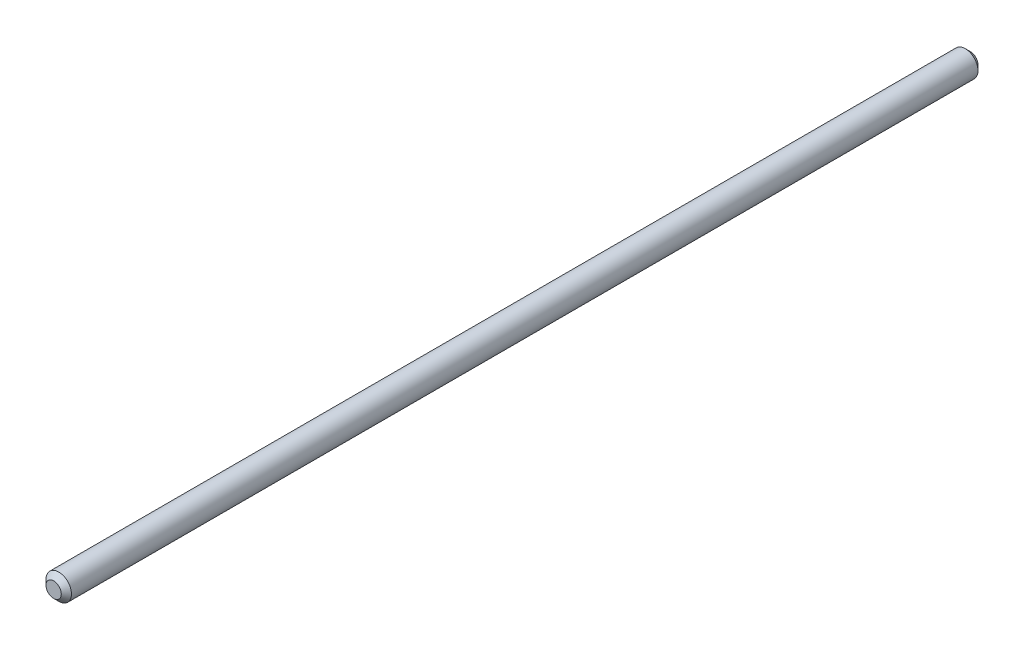
ISO-10303-21;
HEADER;
FILE_DESCRIPTION(('STEP AP214'),'2;1');
FILE_NAME('part.step','',(''),(''),'','','');
FILE_SCHEMA(('AUTOMOTIVE_DESIGN { 1 0 10303 214 1 1 1 1 }'));
ENDSEC;
DATA;
#1=APPLICATION_CONTEXT('core data for automotive mechanical design processes');
#2=APPLICATION_PROTOCOL_DEFINITION('international standard','automotive_design',2000,#1);
#3=PRODUCT_CONTEXT('',#1,'mechanical');
#4=PRODUCT('Part','Part','',(#3));
#5=PRODUCT_RELATED_PRODUCT_CATEGORY('part','',(#4));
#6=PRODUCT_DEFINITION_FORMATION('','',#4);
#7=PRODUCT_DEFINITION_CONTEXT('part definition',#1,'design');
#8=PRODUCT_DEFINITION('design','',#6,#7);
#9=PRODUCT_DEFINITION_SHAPE('','',#8);
#10=(LENGTH_UNIT() NAMED_UNIT(*) SI_UNIT(.MILLI.,.METRE.));
#11=(NAMED_UNIT(*) PLANE_ANGLE_UNIT() SI_UNIT($,.RADIAN.));
#12=(NAMED_UNIT(*) SI_UNIT($,.STERADIAN.) SOLID_ANGLE_UNIT());
#13=UNCERTAINTY_MEASURE_WITH_UNIT(LENGTH_MEASURE(1.E-05),#10,'distance_accuracy_value','');
#14=(GEOMETRIC_REPRESENTATION_CONTEXT(3) GLOBAL_UNCERTAINTY_ASSIGNED_CONTEXT((#13)) GLOBAL_UNIT_ASSIGNED_CONTEXT((#10,
#11,#12)) REPRESENTATION_CONTEXT('',''));
#15=CARTESIAN_POINT('',(0.,0.,0.));
#16=DIRECTION('',(0.,0.,1.));
#17=DIRECTION('',(1.,0.,0.));
#18=AXIS2_PLACEMENT_3D('',#15,#16,#17);
#19=CARTESIAN_POINT('',(0.,0.,90.));
#20=DIRECTION('',(0.,0.,-1.));
#21=DIRECTION('',(-1.,0.,0.));
#22=AXIS2_PLACEMENT_3D('',#19,#20,#21);
#23=CYLINDRICAL_SURFACE('',#22,1.25);
#24=CARTESIAN_POINT('',(0.,0.,89.5));
#25=DIRECTION('',(0.,0.,1.));
#26=DIRECTION('',(1.,0.,0.));
#27=AXIS2_PLACEMENT_3D('',#24,#25,#26);
#28=CIRCLE('',#27,1.25);
#29=CARTESIAN_POINT('',(-1.25,0.,89.5));
#30=VERTEX_POINT('',#29);
#31=EDGE_CURVE('E10',#30,#30,#28,.F.);
#32=CARTESIAN_POINT('',(0.,0.,0.500000000000056));
#33=DIRECTION('',(0.,0.,1.));
#34=DIRECTION('',(1.,0.,0.));
#35=AXIS2_PLACEMENT_3D('',#32,#33,#34);
#36=CIRCLE('',#35,1.25);
#37=CARTESIAN_POINT('',(-1.25,0.,0.500000000000042));
#38=VERTEX_POINT('',#37);
#39=EDGE_CURVE('E55',#38,#38,#36,.T.);
#40=CARTESIAN_POINT('',(-1.25,0.,89.5));
#41=CARTESIAN_POINT('',(-1.25,0.,88.5729166666667));
#42=CARTESIAN_POINT('',(-1.25,0.,87.6458333333334));
#43=CARTESIAN_POINT('',(-1.25,0.,85.7916666666667));
#44=CARTESIAN_POINT('',(-1.25,0.,84.8645833333334));
#45=CARTESIAN_POINT('',(-1.25,0.,83.0104166666667));
#46=CARTESIAN_POINT('',(-1.25,0.,82.0833333333334));
#47=CARTESIAN_POINT('',(-1.25,0.,80.2291666666667));
#48=CARTESIAN_POINT('',(-1.25,0.,79.3020833333334));
#49=CARTESIAN_POINT('',(-1.25,0.,77.4479166666667));
#50=CARTESIAN_POINT('',(-1.25,0.,76.5208333333334));
#51=CARTESIAN_POINT('',(-1.25,0.,74.6666666666667));
#52=CARTESIAN_POINT('',(-1.25,0.,73.7395833333334));
#53=CARTESIAN_POINT('',(-1.25,0.,71.8854166666667));
#54=CARTESIAN_POINT('',(-1.25,0.,70.9583333333334));
#55=CARTESIAN_POINT('',(-1.25,0.,69.1041666666667));
#56=CARTESIAN_POINT('',(-1.25,0.,68.1770833333334));
#57=CARTESIAN_POINT('',(-1.25,0.,66.3229166666667));
#58=CARTESIAN_POINT('',(-1.25,0.,65.3958333333334));
#59=CARTESIAN_POINT('',(-1.25,0.,63.5416666666667));
#60=CARTESIAN_POINT('',(-1.25,0.,62.6145833333334));
#61=CARTESIAN_POINT('',(-1.25,0.,60.7604166666667));
#62=CARTESIAN_POINT('',(-1.25,0.,59.8333333333334));
#63=CARTESIAN_POINT('',(-1.25,0.,57.9791666666667));
#64=CARTESIAN_POINT('',(-1.25,0.,57.0520833333334));
#65=CARTESIAN_POINT('',(-1.25,0.,55.1979166666667));
#66=CARTESIAN_POINT('',(-1.25,0.,54.2708333333334));
#67=CARTESIAN_POINT('',(-1.25,0.,52.4166666666667));
#68=CARTESIAN_POINT('',(-1.25,0.,51.4895833333334));
#69=CARTESIAN_POINT('',(-1.25,0.,49.6354166666667));
#70=CARTESIAN_POINT('',(-1.25,0.,48.7083333333334));
#71=CARTESIAN_POINT('',(-1.25,0.,46.8541666666667));
#72=CARTESIAN_POINT('',(-1.25,0.,45.9270833333334));
#73=CARTESIAN_POINT('',(-1.25,0.,44.0729166666667));
#74=CARTESIAN_POINT('',(-1.25,0.,43.1458333333334));
#75=CARTESIAN_POINT('',(-1.25,0.,41.2916666666667));
#76=CARTESIAN_POINT('',(-1.25,0.,40.3645833333334));
#77=CARTESIAN_POINT('',(-1.25,0.,38.5104166666667));
#78=CARTESIAN_POINT('',(-1.25,0.,37.5833333333334));
#79=CARTESIAN_POINT('',(-1.25,0.,35.7291666666667));
#80=CARTESIAN_POINT('',(-1.25,0.,34.8020833333334));
#81=CARTESIAN_POINT('',(-1.25,0.,32.9479166666667));
#82=CARTESIAN_POINT('',(-1.25,0.,32.0208333333334));
#83=CARTESIAN_POINT('',(-1.25,0.,30.1666666666667));
#84=CARTESIAN_POINT('',(-1.25,0.,29.2395833333334));
#85=CARTESIAN_POINT('',(-1.25,0.,27.3854166666667));
#86=CARTESIAN_POINT('',(-1.25,0.,26.4583333333334));
#87=CARTESIAN_POINT('',(-1.25,0.,24.6041666666667));
#88=CARTESIAN_POINT('',(-1.25,0.,23.6770833333334));
#89=CARTESIAN_POINT('',(-1.25,0.,21.8229166666667));
#90=CARTESIAN_POINT('',(-1.25,0.,20.8958333333334));
#91=CARTESIAN_POINT('',(-1.25,0.,19.0416666666667));
#92=CARTESIAN_POINT('',(-1.25,0.,18.1145833333334));
#93=CARTESIAN_POINT('',(-1.25,0.,16.2604166666667));
#94=CARTESIAN_POINT('',(-1.25,0.,15.3333333333334));
#95=CARTESIAN_POINT('',(-1.25,0.,13.4791666666667));
#96=CARTESIAN_POINT('',(-1.25,0.,12.5520833333334));
#97=CARTESIAN_POINT('',(-1.25,0.,10.6979166666667));
#98=CARTESIAN_POINT('',(-1.25,0.,9.77083333333338));
#99=CARTESIAN_POINT('',(-1.25,0.,7.91666666666672));
#100=CARTESIAN_POINT('',(-1.25,0.,6.98958333333338));
#101=CARTESIAN_POINT('',(-1.25,0.,5.13541666666671));
#102=CARTESIAN_POINT('',(-1.25,0.,4.20833333333338));
#103=CARTESIAN_POINT('',(-1.25,0.,2.35416666666672));
#104=CARTESIAN_POINT('',(-1.25,0.,1.42708333333338));
#105=CARTESIAN_POINT('',(-1.25,0.,0.500000000000042));
#106=B_SPLINE_CURVE_WITH_KNOTS('',3,(#40,#41,#42,#43,#44,#45,#46,#47,#48,#49,#50,#51,#52,#53,
#54,#55,#56,#57,#58,#59,#60,#61,#62,#63,#64,#65,#66,#67,#68,#69,#70,#71,#72,#73,#74,#75,#76,#77,
#78,#79,#80,#81,#82,#83,#84,#85,#86,#87,#88,#89,#90,#91,#92,#93,#94,#95,#96,#97,#98,#99,#100,
#101,#102,#103,#104,#105),.UNSPECIFIED.,.F.,.F.,(4,2,2,2,2,2,2,2,2,2,2,2,2,2,2,2,2,2,2,2,2,2,2,
2,2,2,2,2,2,2,2,2,4),(0.,2.78125000000001,5.56250000000001,8.34375000000001,11.125,13.90625,
16.6875,19.46875,22.25,25.03125,27.8125,30.59375,33.375,36.15625,38.9375,41.71875,44.5,47.28125,
50.0625,52.84375,55.625,58.40625,61.1875,63.96875,66.75,69.53125,72.3125,75.09375,77.875,
80.65625,83.4375,86.21875,89.),.UNSPECIFIED.);
#107=EDGE_CURVE('BSEAM39',#30,#38,#106,.T.);
#108=ORIENTED_EDGE('',*,*,#31,.T.);
#109=ORIENTED_EDGE('',*,*,#39,.T.);
#110=ORIENTED_EDGE('',*,*,#107,.T.);
#111=ORIENTED_EDGE('',*,*,#107,.F.);
#112=EDGE_LOOP('',(#108,#110,#109,#111));
#113=FACE_BOUND('',#112,.T.);
#114=ADVANCED_FACE('F39',(#113),#23,.T.);
#115=CARTESIAN_POINT('',(0.,0.,90.));
#116=DIRECTION('',(0.,0.,1.));
#117=DIRECTION('',(1.,0.,0.));
#118=AXIS2_PLACEMENT_3D('',#115,#116,#117);
#119=PLANE('',#118);
#120=CARTESIAN_POINT('',(0.,0.,90.));
#121=DIRECTION('',(0.,0.,1.));
#122=DIRECTION('',(1.,0.,0.));
#123=AXIS2_PLACEMENT_3D('',#120,#121,#122);
#124=CIRCLE('',#123,0.750000000000042);
#125=CARTESIAN_POINT('',(0.750000000000042,0.,90.));
#126=VERTEX_POINT('',#125);
#127=EDGE_CURVE('E47',#126,#126,#124,.T.);
#128=ORIENTED_EDGE('',*,*,#127,.T.);
#129=EDGE_LOOP('',(#128));
#130=FACE_BOUND('',#129,.T.);
#131=ADVANCED_FACE('F72',(#130),#119,.T.);
#132=CARTESIAN_POINT('',(0.,0.,0.));
#133=DIRECTION('',(0.,0.,1.));
#134=DIRECTION('',(1.,0.,0.));
#135=AXIS2_PLACEMENT_3D('',#132,#133,#134);
#136=PLANE('',#135);
#137=CARTESIAN_POINT('',(0.,0.,0.));
#138=DIRECTION('',(0.,0.,1.));
#139=DIRECTION('',(1.,0.,0.));
#140=AXIS2_PLACEMENT_3D('',#137,#138,#139);
#141=CIRCLE('',#140,0.749999999999931);
#142=CARTESIAN_POINT('',(0.749999999999931,0.,0.));
#143=VERTEX_POINT('',#142);
#144=EDGE_CURVE('E51',#143,#143,#141,.F.);
#145=ORIENTED_EDGE('',*,*,#144,.T.);
#146=EDGE_LOOP('',(#145));
#147=FACE_BOUND('',#146,.T.);
#148=ADVANCED_FACE('F64',(#147),#136,.F.);
#149=CARTESIAN_POINT('',(0.,0.,0.500000000000056));
#150=DIRECTION('',(0.,0.,1.));
#151=DIRECTION('',(1.,0.,0.));
#152=AXIS2_PLACEMENT_3D('',#149,#150,#151);
#153=CONICAL_SURFACE('',#152,1.25,0.785398163397461);
#154=ORIENTED_EDGE('',*,*,#144,.F.);
#155=EDGE_LOOP('',(#154));
#156=FACE_BOUND('',#155,.T.);
#157=ORIENTED_EDGE('',*,*,#39,.F.);
#158=EDGE_LOOP('',(#157));
#159=FACE_BOUND('',#158,.T.);
#160=ADVANCED_FACE('F62',(#156,#159),#153,.T.);
#161=CARTESIAN_POINT('',(0.,0.,90.));
#162=DIRECTION('',(0.,0.,-1.));
#163=DIRECTION('',(-1.,0.,0.));
#164=AXIS2_PLACEMENT_3D('',#161,#162,#163);
#165=CONICAL_SURFACE('',#164,0.750000000000042,0.785398163397447);
#166=ORIENTED_EDGE('',*,*,#31,.F.);
#167=EDGE_LOOP('',(#166));
#168=FACE_BOUND('',#167,.T.);
#169=ORIENTED_EDGE('',*,*,#127,.F.);
#170=EDGE_LOOP('',(#169));
#171=FACE_BOUND('',#170,.T.);
#172=ADVANCED_FACE('F42',(#168,#171),#165,.T.);
#173=CLOSED_SHELL('',(#114,#131,#148,#160,#172));
#174=MANIFOLD_SOLID_BREP('B2',#173);
#175=ADVANCED_BREP_SHAPE_REPRESENTATION('',(#18,#174),#14);
#176=SHAPE_DEFINITION_REPRESENTATION(#9,#175);
ENDSEC;
END-ISO-10303-21;
